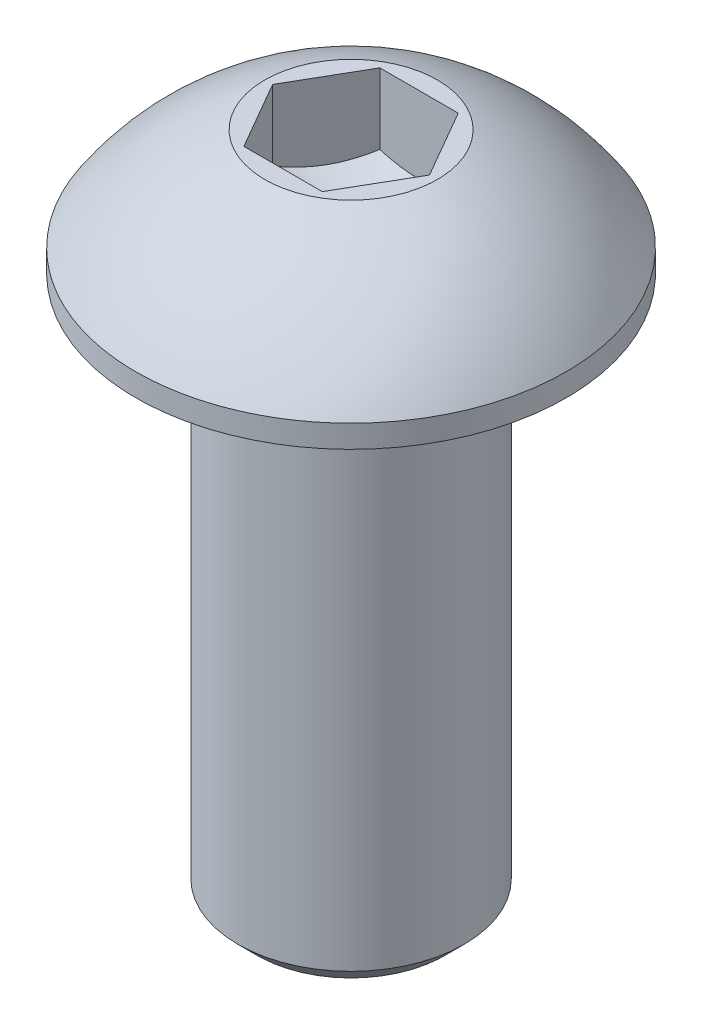
ISO-10303-21;
HEADER;
FILE_DESCRIPTION(('STEP AP214'),'2;1');
FILE_NAME('part.step','',(''),(''),'','','');
FILE_SCHEMA(('AUTOMOTIVE_DESIGN { 1 0 10303 214 1 1 1 1 }'));
ENDSEC;
DATA;
#1=APPLICATION_CONTEXT('core data for automotive mechanical design processes');
#2=APPLICATION_PROTOCOL_DEFINITION('international standard','automotive_design',2000,#1);
#3=PRODUCT_CONTEXT('',#1,'mechanical');
#4=PRODUCT('Part','Part','',(#3));
#5=PRODUCT_RELATED_PRODUCT_CATEGORY('part','',(#4));
#6=PRODUCT_DEFINITION_FORMATION('','',#4);
#7=PRODUCT_DEFINITION_CONTEXT('part definition',#1,'design');
#8=PRODUCT_DEFINITION('design','',#6,#7);
#9=PRODUCT_DEFINITION_SHAPE('','',#8);
#10=(LENGTH_UNIT() NAMED_UNIT(*) SI_UNIT(.MILLI.,.METRE.));
#11=(NAMED_UNIT(*) PLANE_ANGLE_UNIT() SI_UNIT($,.RADIAN.));
#12=(NAMED_UNIT(*) SI_UNIT($,.STERADIAN.) SOLID_ANGLE_UNIT());
#13=UNCERTAINTY_MEASURE_WITH_UNIT(LENGTH_MEASURE(1.E-05),#10,'distance_accuracy_value','');
#14=(GEOMETRIC_REPRESENTATION_CONTEXT(3) GLOBAL_UNCERTAINTY_ASSIGNED_CONTEXT((#13)) GLOBAL_UNIT_ASSIGNED_CONTEXT((#10,
#11,#12)) REPRESENTATION_CONTEXT('',''));
#15=CARTESIAN_POINT('',(0.,0.,0.));
#16=DIRECTION('',(0.,0.,1.));
#17=DIRECTION('',(1.,0.,0.));
#18=AXIS2_PLACEMENT_3D('',#15,#16,#17);
#19=CARTESIAN_POINT('',(-21.8546817558082,61.0625140259608,28.5661719553128));
#20=DIRECTION('',(-0.866156744758905,0.,0.499772441725888));
#21=DIRECTION('',(0.499772441725888,0.,0.866156744758905));
#22=AXIS2_PLACEMENT_3D('',#19,#20,#21);
#23=PLANE('',#22);
#24=CARTESIAN_POINT('',(-22.7342528083247,62.1904554538153,27.0417846839019));
#25=CARTESIAN_POINT('',(-22.6962224262547,62.1684624393729,27.1076956724396));
#26=CARTESIAN_POINT('',(-22.6578636820594,62.1484570513763,27.174175482085));
#27=CARTESIAN_POINT('',(-22.5804812568193,62.1135294060499,27.3082872722689));
#28=CARTESIAN_POINT('',(-22.5414561961779,62.0986195140733,27.3759216432276));
#29=CARTESIAN_POINT('',(-22.4638894317458,62.0753989685705,27.5103527421773));
#30=CARTESIAN_POINT('',(-22.4253596878144,62.0669340457233,27.5771287409575));
#31=CARTESIAN_POINT('',(-22.3481179031428,62.0568098745359,27.7109966612728));
#32=CARTESIAN_POINT('',(-22.3094061449704,62.0551422667687,27.7780880931087));
#33=CARTESIAN_POINT('',(-22.2370748122382,62.0585212235068,27.9034456866582));
#34=CARTESIAN_POINT('',(-22.2034445187518,62.0627268894704,27.9617304248086));
#35=CARTESIAN_POINT('',(-22.1364024681255,62.0760806101147,28.0779211543425));
#36=CARTESIAN_POINT('',(-22.1029909424824,62.0852332430224,28.1358267445177));
#37=CARTESIAN_POINT('',(-22.0358096464586,62.1081249634576,28.252258799859));
#38=CARTESIAN_POINT('',(-22.0020483752909,62.1219613063862,28.3107705350252));
#39=CARTESIAN_POINT('',(-21.9350293192808,62.1533709961757,28.4269214120728));
#40=CARTESIAN_POINT('',(-21.9017706760868,62.1709369529323,28.4845620415652));
#41=CARTESIAN_POINT('',(-21.8687507539284,62.1900007266462,28.5417889429728));
#42=B_SPLINE_CURVE_WITH_KNOTS('',3,(#24,#25,#26,#27,#28,#29,#30,#31,#32,#33,#34,#35,#36,#37,#38,
#39,#40,#41),.UNSPECIFIED.,.F.,.F.,(4,2,2,2,2,2,2,2,4),(0.,0.237724267371401,0.476021395835123,
0.708417766977364,0.94052824763135,1.14260334856072,1.34486578321274,1.5516158742399,
1.75796005763316),.UNSPECIFIED.);
#43=CARTESIAN_POINT('',(-22.7342507548067,62.1904554104379,27.0417867616985));
#44=VERTEX_POINT('',#43);
#45=CARTESIAN_POINT('',(-21.8687514026738,62.1900003520924,28.5417878186306));
#46=VERTEX_POINT('',#45);
#47=EDGE_CURVE('E89',#44,#46,#42,.T.);
#48=ORIENTED_EDGE('',*,*,#47,.T.);
#49=DIRECTION('',(0.,1.,0.));
#50=VECTOR('',#49,1.);
#51=CARTESIAN_POINT('',(-21.8687520125237,61.0625140259608,28.5417867616985));
#52=LINE('',#51,#50);
#53=CARTESIAN_POINT('',(-21.8687520125237,63.7500000000004,28.5417867616985));
#54=VERTEX_POINT('',#53);
#55=EDGE_CURVE('E125',#54,#46,#52,.F.);
#56=ORIENTED_EDGE('',*,*,#55,.F.);
#57=DIRECTION('',(0.499772441725888,0.,0.866156744758905));
#58=VECTOR('',#57,1.);
#59=CARTESIAN_POINT('',(-21.8546817558082,63.7500000000004,28.5661719553128));
#60=LINE('',#59,#58);
#61=CARTESIAN_POINT('',(-22.7342514886348,63.7500000000004,27.0417867616985));
#62=VERTEX_POINT('',#61);
#63=EDGE_CURVE('E135',#54,#62,#60,.F.);
#64=ORIENTED_EDGE('',*,*,#63,.T.);
#65=DIRECTION('',(0.,1.,0.));
#66=VECTOR('',#65,1.);
#67=CARTESIAN_POINT('',(-22.7342520125237,61.0625140259608,27.0417867616985));
#68=LINE('',#67,#66);
#69=EDGE_CURVE('E133',#62,#44,#68,.F.);
#70=ORIENTED_EDGE('',*,*,#69,.T.);
#71=EDGE_LOOP('',(#48,#56,#64,#70));
#72=FACE_BOUND('',#71,.T.);
#73=ADVANCED_FACE('F17',(#72),#23,.T.);
#74=CARTESIAN_POINT('',(-22.7483222692391,61.0625140259608,30.0661719553128));
#75=DIRECTION('',(-0.866156744758905,0.,-0.499772441725888));
#76=DIRECTION('',(-0.499772441725888,0.,0.866156744758905));
#77=AXIS2_PLACEMENT_3D('',#74,#75,#76);
#78=PLANE('',#77);
#79=CARTESIAN_POINT('',(-21.86875020426,62.1900006982455,28.5417842269256));
#80=CARTESIAN_POINT('',(-21.9067681694746,62.1680447159372,28.6076728641433));
#81=CARTESIAN_POINT('',(-21.9451142072188,62.1480787424738,28.6741303110434));
#82=CARTESIAN_POINT('',(-22.0224698008868,62.1132330548813,28.8081953492313));
#83=CARTESIAN_POINT('',(-22.0614807284407,62.0983656634246,28.8758053181742));
#84=CARTESIAN_POINT('',(-22.1390187494334,62.0752296986146,29.0101866672823));
#85=CARTESIAN_POINT('',(-22.1775339263733,62.0668069329424,29.076937396266));
#86=CARTESIAN_POINT('',(-22.2547448417093,62.0567640464411,29.2107517996408));
#87=CARTESIAN_POINT('',(-22.2934403005898,62.0551355919145,29.2778149895856));
#88=CARTESIAN_POINT('',(-22.365770989413,62.0585827085798,29.4031714712144));
#89=CARTESIAN_POINT('',(-22.3994170626068,62.0628231270349,29.4614835558376));
#90=CARTESIAN_POINT('',(-22.4664894034338,62.0762481138211,29.5777267803725));
#91=CARTESIAN_POINT('',(-22.4999154380555,62.0854372676584,29.6356575164521));
#92=CARTESIAN_POINT('',(-22.5671254577182,62.1084023640031,29.7521393530926));
#93=CARTESIAN_POINT('',(-22.6009009168827,62.1222755995713,29.8106756774333));
#94=CARTESIAN_POINT('',(-22.667947538881,62.1537572045911,29.9268743290077));
#95=CARTESIAN_POINT('',(-22.7012195633744,62.171358169387,29.9845381495859));
#96=CARTESIAN_POINT('',(-22.7342527676128,62.1904554840777,30.0417880703452));
#97=B_SPLINE_CURVE_WITH_KNOTS('',3,(#79,#80,#81,#82,#83,#84,#85,#86,#87,#88,#89,#90,#91,#92,#93,
#94,#95,#96),.UNSPECIFIED.,.F.,.F.,(4,2,2,2,2,2,2,2,4),(0.,0.237619597645058,0.475809511941949,
0.708105088056941,0.940115653499667,1.14229164083243,1.34465528790194,1.55151117233297,
1.75795995451333),.UNSPECIFIED.);
#98=CARTESIAN_POINT('',(-22.734252814121,62.190455510966,30.0417881509487));
#99=VERTEX_POINT('',#98);
#100=EDGE_CURVE('E103',#46,#99,#97,.T.);
#101=ORIENTED_EDGE('',*,*,#100,.T.);
#102=DIRECTION('',(0.,1.,0.));
#103=VECTOR('',#102,1.);
#104=CARTESIAN_POINT('',(-22.7342528875693,61.0625140259608,30.041788278242));
#105=LINE('',#104,#103);
#106=CARTESIAN_POINT('',(-22.7342524500465,63.7500000000004,30.0417875199703));
#107=VERTEX_POINT('',#106);
#108=EDGE_CURVE('E122',#99,#107,#105,.T.);
#109=ORIENTED_EDGE('',*,*,#108,.T.);
#110=DIRECTION('',(-0.499772441725888,0.,0.866156744758905));
#111=VECTOR('',#110,1.);
#112=CARTESIAN_POINT('',(-22.7483222692391,63.7500000000004,30.0661719553128));
#113=LINE('',#112,#111);
#114=EDGE_CURVE('E130',#107,#54,#113,.F.);
#115=ORIENTED_EDGE('',*,*,#114,.T.);
#116=ORIENTED_EDGE('',*,*,#55,.T.);
#117=EDGE_LOOP('',(#101,#109,#115,#116));
#118=FACE_BOUND('',#117,.T.);
#119=ADVANCED_FACE('F234',(#118),#78,.T.);
#120=CARTESIAN_POINT('',(-25.3448222692391,61.0625140259608,28.5174015680842));
#121=DIRECTION('',(0.866156744758905,0.,-0.499772441725888));
#122=DIRECTION('',(-0.499772441725888,0.,-0.866156744758905));
#123=AXIS2_PLACEMENT_3D('',#120,#121,#122);
#124=PLANE('',#123);
#125=CARTESIAN_POINT('',(-24.4652514786392,62.1904553031669,30.0417883751702));
#126=CARTESIAN_POINT('',(-24.5032818590422,62.1684622991971,29.9758773961842));
#127=CARTESIAN_POINT('',(-24.5416405999992,62.148456923675,29.9093975948844));
#128=CARTESIAN_POINT('',(-24.6190230169533,62.1135293054301,29.775285821065));
#129=CARTESIAN_POINT('',(-24.6580480725407,62.0986194280445,29.7076514581276));
#130=CARTESIAN_POINT('',(-24.7356148272826,62.0753989112265,29.5732203754476));
#131=CARTESIAN_POINT('',(-24.7741445665863,62.0669340025411,29.5064443848775));
#132=CARTESIAN_POINT('',(-24.851386341352,62.0568098588198,29.3725764818682));
#133=CARTESIAN_POINT('',(-24.8900980942473,62.0551422643686,29.3054850591264));
#134=CARTESIAN_POINT('',(-24.9624293971139,62.0585212429134,29.1801275173046));
#135=CARTESIAN_POINT('',(-24.9960596661154,62.0627269146017,29.1218428216002));
#136=CARTESIAN_POINT('',(-25.0631016678259,62.0760806388834,29.0056521768503));
#137=CARTESIAN_POINT('',(-25.0965131690391,62.0852332696858,28.9477466290119));
#138=CARTESIAN_POINT('',(-25.1636944154409,62.1081249788471,28.8313146596682));
#139=CARTESIAN_POINT('',(-25.1974556614366,62.1219613123591,28.7728029681282));
#140=CARTESIAN_POINT('',(-25.2644746679246,62.1533709778999,28.6566521769087));
#141=CARTESIAN_POINT('',(-25.2977332867657,62.1709369198492,28.599011589623));
#142=CARTESIAN_POINT('',(-25.3307531849423,62.1900006768672,28.5417847297771));
#143=B_SPLINE_CURVE_WITH_KNOTS('',3,(#125,#126,#127,#128,#129,#130,#131,#132,#133,#134,#135,
#136,#137,#138,#139,#140,#141,#142),.UNSPECIFIED.,.F.,.F.,(4,2,2,2,2,2,2,2,4),(0.,
0.237724232173708,0.476021324387903,0.70841766280578,0.940528111140701,1.14260306690965,
1.34486535582354,1.5516152934174,1.7579593244486),.UNSPECIFIED.);
#144=CARTESIAN_POINT('',(-24.4652516116366,62.1904552792749,30.0417874564768));
#145=VERTEX_POINT('',#144);
#146=CARTESIAN_POINT('',(-25.3307533026176,62.1900007448073,28.5417845258338));
#147=VERTEX_POINT('',#146);
#148=EDGE_CURVE('E98',#145,#147,#143,.T.);
#149=ORIENTED_EDGE('',*,*,#148,.T.);
#150=DIRECTION('',(0.,1.,0.));
#151=VECTOR('',#150,1.);
#152=CARTESIAN_POINT('',(-25.3307534410709,61.0625140259608,28.5417842858801));
#153=LINE('',#152,#151);
#154=CARTESIAN_POINT('',(-25.3307527267973,63.7500000000004,28.5417855237893));
#155=VERTEX_POINT('',#154);
#156=EDGE_CURVE('E92',#147,#155,#153,.T.);
#157=ORIENTED_EDGE('',*,*,#156,.T.);
#158=DIRECTION('',(-0.499772441725888,0.,-0.866156744758905));
#159=VECTOR('',#158,1.);
#160=CARTESIAN_POINT('',(-25.3448222692391,63.7500000000004,28.5174015680842));
#161=LINE('',#160,#159);
#162=CARTESIAN_POINT('',(-24.4652520561413,63.7500000000004,30.0417867616985));
#163=VERTEX_POINT('',#162);
#164=EDGE_CURVE('E119',#155,#163,#161,.F.);
#165=ORIENTED_EDGE('',*,*,#164,.T.);
#166=DIRECTION('',(0.,1.,0.));
#167=VECTOR('',#166,1.);
#168=CARTESIAN_POINT('',(-24.4652520125237,61.0625140259608,30.0417867616985));
#169=LINE('',#168,#167);
#170=EDGE_CURVE('E115',#163,#145,#169,.F.);
#171=ORIENTED_EDGE('',*,*,#170,.T.);
#172=EDGE_LOOP('',(#149,#157,#165,#171));
#173=FACE_BOUND('',#172,.T.);
#174=ADVANCED_FACE('F228',(#173),#124,.T.);
#175=CARTESIAN_POINT('',(-23.5997520125237,62.1964573418268,28.5417867616985));
#176=DIRECTION('',(0.,1.,0.));
#177=DIRECTION('',(-1.,0.,0.));
#178=AXIS2_PLACEMENT_3D('',#175,#176,#177);
#179=CONICAL_SURFACE('',#178,1.74218444413155,1.04719755108581);
#180=ORIENTED_EDGE('',*,*,#100,.F.);
#181=ORIENTED_EDGE('',*,*,#47,.F.);
#182=CARTESIAN_POINT('',(-23.5997520125237,62.0566320877781,27.0417867616985));
#183=CARTESIAN_POINT('',(-23.5630148355516,62.0566274119055,27.0417867616985));
#184=CARTESIAN_POINT('',(-23.5262826386131,62.0574117739379,27.0417867616985));
#185=CARTESIAN_POINT('',(-23.4528902735742,62.0605174408231,27.0417867616985));
#186=CARTESIAN_POINT('',(-23.4162300926826,62.0628384421505,27.0417867616985));
#187=CARTESIAN_POINT('',(-23.3068066593674,62.0720135290242,27.0417867616985));
#188=CARTESIAN_POINT('',(-23.2342202637973,62.0810805744324,27.0417867616985));
#189=CARTESIAN_POINT('',(-23.0900035149575,62.1043976980786,27.0417867616985));
#190=CARTESIAN_POINT('',(-23.0183721891419,62.1186420069205,27.0417867616985));
#191=CARTESIAN_POINT('',(-22.8757252559622,62.1514940000289,27.0417867616985));
#192=CARTESIAN_POINT('',(-22.8047146168983,62.1701234572168,27.0417867616985));
#193=CARTESIAN_POINT('',(-22.7342494569347,62.1904557849312,27.0417867616985));
#194=B_SPLINE_CURVE_WITH_KNOTS('',3,(#182,#183,#184,#185,#186,#187,#188,#189,#190,#191,#192,
#193),.UNSPECIFIED.,.F.,.F.,(4,2,2,2,2,4),(0.,0.110193872639444,0.220365985687168,
0.439573010559326,0.658536502537635,0.878611009104459),.UNSPECIFIED.);
#195=CARTESIAN_POINT('',(-23.5997520125237,62.0566320877703,27.0417867616985));
#196=VERTEX_POINT('',#195);
#197=EDGE_CURVE('E21',#196,#44,#194,.T.);
#198=ORIENTED_EDGE('',*,*,#197,.F.);
#199=DIRECTION('',(0.,-0.499999999999999,0.86602540378444));
#200=VECTOR('',#199,1.);
#201=CARTESIAN_POINT('',(-23.5997520124626,288142.496324036,-498942.916426477));
#202=LINE('',#201,#200);
#203=CARTESIAN_POINT('',(-23.5997520125237,61.1906066839367,28.5417867614512));
#204=VERTEX_POINT('',#203);
#205=EDGE_CURVE('E87',#196,#204,#202,.T.);
#206=ORIENTED_EDGE('',*,*,#205,.T.);
#207=DIRECTION('',(0.,-0.499999999999999,-0.86602540378444));
#208=VECTOR('',#207,1.);
#209=CARTESIAN_POINT('',(-23.5997520125237,288142.496324036,499000.));
#210=LINE('',#209,#208);
#211=CARTESIAN_POINT('',(-23.5997520125237,62.0566320877683,30.041786761685));
#212=VERTEX_POINT('',#211);
#213=EDGE_CURVE('E102',#204,#212,#210,.F.);
#214=ORIENTED_EDGE('',*,*,#213,.T.);
#215=CARTESIAN_POINT('',(-22.7342495240769,62.1904557545893,30.0417867784536));
#216=CARTESIAN_POINT('',(-22.804714680115,62.1701234362746,30.041786767693));
#217=CARTESIAN_POINT('',(-22.8757253141594,62.1514939844736,30.041786763299));
#218=CARTESIAN_POINT('',(-23.0183722364004,62.1186419981777,30.0417867601061));
#219=CARTESIAN_POINT('',(-23.0900035563042,62.1043976907895,30.0417867612792));
#220=CARTESIAN_POINT('',(-23.2342202935157,62.0810805702296,30.0417867621183));
#221=CARTESIAN_POINT('',(-23.3068066833713,62.0720135264653,30.0417867617827));
#222=CARTESIAN_POINT('',(-23.4162301078834,62.062838441151,30.0417867616562));
#223=CARTESIAN_POINT('',(-23.4528902857582,62.0605174401922,30.0417867616773));
#224=CARTESIAN_POINT('',(-23.5262826447218,62.0574117737952,30.0417867617197));
#225=CARTESIAN_POINT('',(-23.5630148386015,62.0566274118812,30.0417867617408));
#226=CARTESIAN_POINT('',(-23.5997520125237,62.0566320877781,30.0417867616985));
#227=B_SPLINE_CURVE_WITH_KNOTS('',3,(#215,#216,#217,#218,#219,#220,#221,#222,#223,#224,#225,
#226),.UNSPECIFIED.,.F.,.F.,(4,2,2,2,2,4),(0.,0.220074487947493,0.439037961831188,
0.658244969051029,0.768417073011579,0.878610936485432),.UNSPECIFIED.);
#228=EDGE_CURVE('E97',#99,#212,#227,.T.);
#229=ORIENTED_EDGE('',*,*,#228,.F.);
#230=EDGE_LOOP('',(#180,#181,#198,#206,#214,#229));
#231=FACE_BOUND('',#230,.T.);
#232=ADVANCED_FACE('F85',(#231),#179,.F.);
#233=CARTESIAN_POINT('',(-23.5997520125237,62.1964573417131,28.5417867616985));
#234=DIRECTION('',(0.,1.,0.));
#235=DIRECTION('',(0.,0.,1.));
#236=AXIS2_PLACEMENT_3D('',#233,#234,#235);
#237=CONICAL_SURFACE('',#236,1.74218444397811,1.04719755111499);
#238=CARTESIAN_POINT('',(-25.330753448529,62.1900005906256,28.5417888372929));
#239=CARTESIAN_POINT('',(-25.2927355416487,62.1680445839386,28.4759001819881));
#240=CARTESIAN_POINT('',(-25.2543895290304,62.1480786086294,28.4094427297396));
#241=CARTESIAN_POINT('',(-25.1770339570476,62.1132329382352,28.275377693286));
#242=CARTESIAN_POINT('',(-25.1380230259896,62.0983655658131,28.2077677314652));
#243=CARTESIAN_POINT('',(-25.0604850065462,62.075229634716,28.0733863944261));
#244=CARTESIAN_POINT('',(-25.0219698344532,62.0668068838048,28.0066356704445));
#245=CARTESIAN_POINT('',(-24.9447589272823,62.0567640278267,27.8728212787519));
#246=CARTESIAN_POINT('',(-24.9060634717206,62.0551355890925,27.8057580954829));
#247=CARTESIAN_POINT('',(-24.8337328001686,62.0585827327587,27.6804016443662));
#248=CARTESIAN_POINT('',(-24.8000867407571,62.0628231611418,27.6220895834321));
#249=CARTESIAN_POINT('',(-24.7330144276295,62.0762481628938,27.5058464067577));
#250=CARTESIAN_POINT('',(-24.699588406924,62.0854373217478,27.447915694848));
#251=CARTESIAN_POINT('',(-24.6323784153881,62.1084024234997,27.3314339069965));
#252=CARTESIAN_POINT('',(-24.5986029704295,62.1222756593373,27.2728976072655));
#253=CARTESIAN_POINT('',(-24.5315563763409,62.1537572610169,27.1566990040398));
#254=CARTESIAN_POINT('',(-24.4982843655537,62.1713582222283,27.0990352072053));
#255=CARTESIAN_POINT('',(-24.4652511747785,62.1904555318397,27.0417853098005));
#256=B_SPLINE_CURVE_WITH_KNOTS('',3,(#238,#239,#240,#241,#242,#243,#244,#245,#246,#247,#248,
#249,#250,#251,#252,#253,#254,#255),.UNSPECIFIED.,.F.,.F.,(4,2,2,2,2,2,2,2,4),(0.,
0.237619575800249,0.475809465472198,0.708105017028062,0.940115559015367,1.14229146651883,
1.3446550330063,1.55151083429702,1.75795953444988),.UNSPECIFIED.);
#257=CARTESIAN_POINT('',(-24.4652528135948,62.1904556270957,27.0417860649148));
#258=VERTEX_POINT('',#257);
#259=EDGE_CURVE('E175',#147,#258,#256,.T.);
#260=ORIENTED_EDGE('',*,*,#259,.F.);
#261=ORIENTED_EDGE('',*,*,#148,.F.);
#262=CARTESIAN_POINT('',(-23.5997520125237,62.0566320877624,30.0417867616985));
#263=CARTESIAN_POINT('',(-23.6364891905073,62.0566274118893,30.0417867616985));
#264=CARTESIAN_POINT('',(-23.6732213884567,62.0574117739652,30.0417867616985));
#265=CARTESIAN_POINT('',(-23.7466137555115,62.0605174410205,30.0417867616985));
#266=CARTESIAN_POINT('',(-23.7832739374077,62.0628384424746,30.0417867616985));
#267=CARTESIAN_POINT('',(-23.8926973736984,62.0720135298438,30.0417867616985));
#268=CARTESIAN_POINT('',(-23.9652837712248,62.0810805757363,30.0417867616985));
#269=CARTESIAN_POINT('',(-24.1095005239055,62.1043977005855,30.0417867616985));
#270=CARTESIAN_POINT('',(-24.181131851606,62.1186420101453,30.0417867616985));
#271=CARTESIAN_POINT('',(-24.3237787885203,62.1514940048561,30.0417867616985));
#272=CARTESIAN_POINT('',(-24.3947894294336,62.1701234629302,30.0417867616985));
#273=CARTESIAN_POINT('',(-24.4652545912193,62.1904557915737,30.0417867616985));
#274=B_SPLINE_CURVE_WITH_KNOTS('',3,(#262,#263,#264,#265,#266,#267,#268,#269,#270,#271,#272,
#273),.UNSPECIFIED.,.F.,.F.,(4,2,2,2,2,4),(0.,0.11019387567229,0.220365991749922,
0.439573022608127,0.658536520545098,0.878611033143368),.UNSPECIFIED.);
#275=EDGE_CURVE('E216',#212,#145,#274,.T.);
#276=ORIENTED_EDGE('',*,*,#275,.F.);
#277=ORIENTED_EDGE('',*,*,#213,.F.);
#278=ORIENTED_EDGE('',*,*,#205,.F.);
#279=CARTESIAN_POINT('',(-24.4652544490187,62.1904556369192,27.0417865881283));
#280=CARTESIAN_POINT('',(-24.3947892842702,62.1701233833668,27.0417866996));
#281=CARTESIAN_POINT('',(-24.3237786510699,62.1514939598444,27.0417867451189));
#282=CARTESIAN_POINT('',(-24.181131738041,62.1186419972786,27.0417867781944));
#283=CARTESIAN_POINT('',(-24.1095004264492,62.1043976855637,27.0417867660425));
#284=CARTESIAN_POINT('',(-23.9652837022473,62.0810805638417,27.0417867573496));
#285=CARTESIAN_POINT('',(-23.8926973170677,62.0720135233654,27.041786760826));
#286=CARTESIAN_POINT('',(-23.7832739007154,62.0628384402689,27.041786762137));
#287=CARTESIAN_POINT('',(-23.7466137260066,62.0605174395945,27.0417867619178));
#288=CARTESIAN_POINT('',(-23.6732213736119,62.0574117735156,27.0417867614792));
#289=CARTESIAN_POINT('',(-23.6364891831354,62.056627411626,27.0417867612598));
#290=CARTESIAN_POINT('',(-23.5997520125237,62.0566320877624,27.0417867616985));
#291=B_SPLINE_CURVE_WITH_KNOTS('',3,(#279,#280,#281,#282,#283,#284,#285,#286,#287,#288,#289,
#290),.UNSPECIFIED.,.F.,.F.,(4,2,2,2,2,4),(0.,0.220074464165182,0.439037917358345,
0.658244908711105,0.768417003217285,0.878610856576213),.UNSPECIFIED.);
#292=EDGE_CURVE('E93',#258,#196,#291,.T.);
#293=ORIENTED_EDGE('',*,*,#292,.F.);
#294=EDGE_LOOP('',(#260,#261,#276,#277,#278,#293));
#295=FACE_BOUND('',#294,.T.);
#296=ADVANCED_FACE('F100',(#295),#237,.F.);
#297=CARTESIAN_POINT('',(-24.4934053389993,61.0625140259608,30.0417867616985));
#298=DIRECTION('',(0.,0.,-1.));
#299=DIRECTION('',(-1.,0.,0.));
#300=AXIS2_PLACEMENT_3D('',#297,#298,#299);
#301=PLANE('',#300);
#302=ORIENTED_EDGE('',*,*,#275,.T.);
#303=ORIENTED_EDGE('',*,*,#170,.F.);
#304=DIRECTION('',(1.,0.,0.));
#305=VECTOR('',#304,1.);
#306=CARTESIAN_POINT('',(-25.5419340125236,63.7500000000004,30.0417867616985));
#307=LINE('',#306,#305);
#308=EDGE_CURVE('E142',#107,#163,#307,.F.);
#309=ORIENTED_EDGE('',*,*,#308,.F.);
#310=ORIENTED_EDGE('',*,*,#108,.F.);
#311=ORIENTED_EDGE('',*,*,#228,.T.);
#312=EDGE_LOOP('',(#302,#303,#309,#310,#311));
#313=FACE_BOUND('',#312,.T.);
#314=ADVANCED_FACE('F210',(#313),#301,.T.);
#315=CARTESIAN_POINT('',(-24.4511817558082,61.0625140259608,27.0174015680842));
#316=DIRECTION('',(0.866156744758905,0.,0.499772441725888));
#317=DIRECTION('',(0.499772441725888,0.,-0.866156744758905));
#318=AXIS2_PLACEMENT_3D('',#315,#316,#317);
#319=PLANE('',#318);
#320=ORIENTED_EDGE('',*,*,#259,.T.);
#321=DIRECTION('',(0.,1.,0.));
#322=VECTOR('',#321,1.);
#323=CARTESIAN_POINT('',(-24.4652520125237,61.0625140259608,27.0417867616985));
#324=LINE('',#323,#322);
#325=CARTESIAN_POINT('',(-24.4652520125237,63.7500000000004,27.0417867616985));
#326=VERTEX_POINT('',#325);
#327=EDGE_CURVE('E41',#326,#258,#324,.F.);
#328=ORIENTED_EDGE('',*,*,#327,.F.);
#329=DIRECTION('',(0.499772441725888,0.,-0.866156744758906));
#330=VECTOR('',#329,1.);
#331=CARTESIAN_POINT('',(-25.3307520125237,63.7500000000004,28.5417867616985));
#332=LINE('',#331,#330);
#333=EDGE_CURVE('E145',#155,#326,#332,.T.);
#334=ORIENTED_EDGE('',*,*,#333,.F.);
#335=ORIENTED_EDGE('',*,*,#156,.F.);
#336=EDGE_LOOP('',(#320,#328,#334,#335));
#337=FACE_BOUND('',#336,.T.);
#338=ADVANCED_FACE('F192',(#337),#319,.T.);
#339=CARTESIAN_POINT('',(-22.706098686048,61.0625140259608,27.0417867616985));
#340=DIRECTION('',(0.,0.,1.));
#341=DIRECTION('',(1.,0.,0.));
#342=AXIS2_PLACEMENT_3D('',#339,#340,#341);
#343=PLANE('',#342);
#344=ORIENTED_EDGE('',*,*,#197,.T.);
#345=ORIENTED_EDGE('',*,*,#69,.F.);
#346=DIRECTION('',(1.,0.,0.));
#347=VECTOR('',#346,1.);
#348=CARTESIAN_POINT('',(-25.5419340125236,63.7500000000004,27.0417867616985));
#349=LINE('',#348,#347);
#350=EDGE_CURVE('E174',#326,#62,#349,.T.);
#351=ORIENTED_EDGE('',*,*,#350,.F.);
#352=ORIENTED_EDGE('',*,*,#327,.T.);
#353=ORIENTED_EDGE('',*,*,#292,.T.);
#354=EDGE_LOOP('',(#344,#345,#351,#352,#353));
#355=FACE_BOUND('',#354,.T.);
#356=ADVANCED_FACE('F94',(#355),#343,.T.);
#357=CARTESIAN_POINT('',(-25.5419340125236,63.7500000000004,30.4839687616985));
#358=DIRECTION('',(0.,1.,0.));
#359=DIRECTION('',(0.,0.,1.));
#360=AXIS2_PLACEMENT_3D('',#357,#358,#359);
#361=PLANE('',#360);
#362=CARTESIAN_POINT('',(-23.5997520125237,63.7500000000004,26.6376867616985));
#363=CARTESIAN_POINT('',(-23.5462908556264,63.7500000000004,26.6376870822875));
#364=CARTESIAN_POINT('',(-23.4928198734091,63.7500000000004,26.6399403082542));
#365=CARTESIAN_POINT('',(-23.3862474286709,63.7500000000004,26.6489385571315));
#366=CARTESIAN_POINT('',(-23.333146079922,63.7500000000004,26.6556849061613));
#367=CARTESIAN_POINT('',(-23.2276110754911,63.7500000000004,26.6736390679341));
#368=CARTESIAN_POINT('',(-23.1751786167028,63.7500000000005,26.6848539627418));
#369=CARTESIAN_POINT('',(-23.0714157292092,63.7500000000003,26.7116678398788));
#370=CARTESIAN_POINT('',(-23.0200862313458,63.7499999999999,26.7272703799234));
#371=CARTESIAN_POINT('',(-22.8685215512124,63.7499999999996,26.7804441461893));
#372=CARTESIAN_POINT('',(-22.7704551130834,63.7500000000004,26.8244251928022));
#373=CARTESIAN_POINT('',(-22.583110239468,63.7500000000004,26.9282479031549));
#374=CARTESIAN_POINT('',(-22.4938321382278,63.7499999999997,26.988090169824));
#375=CARTESIAN_POINT('',(-22.3684408274207,63.75,27.08839529384));
#376=CARTESIAN_POINT('',(-22.3280410747537,63.7500000000003,27.1236137742219));
#377=CARTESIAN_POINT('',(-22.2503870331904,63.7500000000005,27.1972892516482));
#378=CARTESIAN_POINT('',(-22.2131297491483,63.7500000000004,27.2357430935362));
#379=CARTESIAN_POINT('',(-22.1063975560784,63.7500000000003,27.3556502463894));
#380=CARTESIAN_POINT('',(-22.0419351834624,63.7500000000004,27.4416709244357));
#381=CARTESIAN_POINT('',(-21.928405286053,63.7500000000004,27.6232669284007));
#382=CARTESIAN_POINT('',(-21.879337180765,63.7500000000004,27.7188418938626));
#383=CARTESIAN_POINT('',(-21.7979340758051,63.7500000000004,27.9168837214962));
#384=CARTESIAN_POINT('',(-21.7655988974176,63.7500000000004,28.0193505100468));
#385=CARTESIAN_POINT('',(-21.71859271446,63.7500000000004,28.2282559610265));
#386=CARTESIAN_POINT('',(-21.7039218042245,63.7500000000004,28.334694644664));
#387=CARTESIAN_POINT('',(-21.6926563336143,63.7500000000004,28.5485243519607));
#388=CARTESIAN_POINT('',(-21.6960617732395,63.7500000000004,28.65591537562));
#389=CARTESIAN_POINT('',(-21.7208565836103,63.7500000000004,28.8686036123985));
#390=CARTESIAN_POINT('',(-21.7422458583149,63.7500000000004,28.9739008366963));
#391=CARTESIAN_POINT('',(-21.8023886890805,63.7500000000004,29.1793999143027));
#392=CARTESIAN_POINT('',(-21.8411424306036,63.7500000000004,29.2796017131766));
#393=CARTESIAN_POINT('',(-21.9349622801049,63.7500000000004,29.4721217955092));
#394=CARTESIAN_POINT('',(-21.9900290032398,63.7500000000004,29.564439781503));
#395=CARTESIAN_POINT('',(-22.0835708570972,63.7500000000004,29.6948982343521));
#396=CARTESIAN_POINT('',(-22.1165812752758,63.7500000000004,29.7370540816548));
#397=CARTESIAN_POINT('',(-22.1860638357111,63.7500000000004,29.818481349449));
#398=CARTESIAN_POINT('',(-22.2225392880671,63.7500000000004,29.8577499469715));
#399=CARTESIAN_POINT('',(-22.3366966862082,63.7500000000004,29.970675529456));
#400=CARTESIAN_POINT('',(-22.4191925084001,63.7500000000004,30.0395675867781));
#401=CARTESIAN_POINT('',(-22.5945908828667,63.7500000000004,30.1625011749033));
#402=CARTESIAN_POINT('',(-22.6874930393916,63.7500000000004,30.2165432701765));
#403=CARTESIAN_POINT('',(-22.8326313335269,63.7500000000004,30.2853486279507));
#404=CARTESIAN_POINT('',(-22.8820372084926,63.7500000000004,30.3062583416176));
#405=CARTESIAN_POINT('',(-22.9824081534266,63.7500000000004,30.3438268688872));
#406=CARTESIAN_POINT('',(-23.0333719238721,63.7500000000004,30.3604891227));
#407=CARTESIAN_POINT('',(-23.1364361274676,63.7500000000004,30.3894331898371));
#408=CARTESIAN_POINT('',(-23.1885346261879,63.7500000000004,30.4017219202547));
#409=CARTESIAN_POINT('',(-23.2935715870608,63.7500000000004,30.4218686646798));
#410=CARTESIAN_POINT('',(-23.3465097967267,63.7500000000004,30.4297279855104));
#411=CARTESIAN_POINT('',(-23.4329003820953,63.7500000000004,30.4388567026777));
#412=CARTESIAN_POINT('',(-23.4662144405515,63.7500000000004,30.4414921404598));
#413=CARTESIAN_POINT('',(-23.5329350577243,63.7500000000004,30.4450072701458));
#414=CARTESIAN_POINT('',(-23.5663416164409,63.7500000000004,30.4458869620496));
#415=CARTESIAN_POINT('',(-23.653213169421,63.7500000000004,30.4458864411095));
#416=CARTESIAN_POINT('',(-23.7066841516383,63.7500000000004,30.4436332151428));
#417=CARTESIAN_POINT('',(-23.8132565963765,63.7500000000004,30.4346349662655));
#418=CARTESIAN_POINT('',(-23.8663579451254,63.7500000000004,30.4278886172357));
#419=CARTESIAN_POINT('',(-23.9718929495563,63.7500000000004,30.4099344554629));
#420=CARTESIAN_POINT('',(-24.0243254083446,63.7500000000005,30.3987195606552));
#421=CARTESIAN_POINT('',(-24.1280882958382,63.7500000000003,30.3719056835181));
#422=CARTESIAN_POINT('',(-24.1794177937016,63.7499999999999,30.3563031434736));
#423=CARTESIAN_POINT('',(-24.330982473835,63.7499999999996,30.3031293772077));
#424=CARTESIAN_POINT('',(-24.429048911964,63.7500000000004,30.2591483305949));
#425=CARTESIAN_POINT('',(-24.6163937855794,63.7500000000004,30.1553256202422));
#426=CARTESIAN_POINT('',(-24.7056718868196,63.7499999999997,30.095483353573));
#427=CARTESIAN_POINT('',(-24.8310631976267,63.75,29.995178229557));
#428=CARTESIAN_POINT('',(-24.8714629502937,63.7500000000003,29.9599597491751));
#429=CARTESIAN_POINT('',(-24.949116991857,63.7500000000005,29.8862842717488));
#430=CARTESIAN_POINT('',(-24.9863742758991,63.7500000000004,29.8478304298608));
#431=CARTESIAN_POINT('',(-25.093106468969,63.7500000000003,29.7279232770075));
#432=CARTESIAN_POINT('',(-25.157568841585,63.7500000000004,29.6419025989613));
#433=CARTESIAN_POINT('',(-25.2710987389944,63.7500000000004,29.4603065949962));
#434=CARTESIAN_POINT('',(-25.3201668442824,63.7500000000004,29.3647316295344));
#435=CARTESIAN_POINT('',(-25.4015699492423,63.7500000000004,29.1666898019007));
#436=CARTESIAN_POINT('',(-25.4339051276297,63.7500000000004,29.0642230133501));
#437=CARTESIAN_POINT('',(-25.4809113105874,63.7500000000004,28.8553175623705));
#438=CARTESIAN_POINT('',(-25.4955822208229,63.7500000000004,28.748878878733));
#439=CARTESIAN_POINT('',(-25.5068476914331,63.7500000000004,28.5350491714363));
#440=CARTESIAN_POINT('',(-25.5034422518079,63.7500000000004,28.427658147777));
#441=CARTESIAN_POINT('',(-25.4786474414371,63.7500000000004,28.2149699109985));
#442=CARTESIAN_POINT('',(-25.4572581667325,63.7500000000004,28.1096726867007));
#443=CARTESIAN_POINT('',(-25.3971153359669,63.7500000000004,27.9041736090943));
#444=CARTESIAN_POINT('',(-25.3583615944438,63.7500000000004,27.8039718102204));
#445=CARTESIAN_POINT('',(-25.2645417449425,63.7500000000004,27.6114517278878));
#446=CARTESIAN_POINT('',(-25.2094750218076,63.7500000000004,27.5191337418939));
#447=CARTESIAN_POINT('',(-25.1159331679502,63.7500000000004,27.3886752890449));
#448=CARTESIAN_POINT('',(-25.0829227497716,63.7500000000004,27.3465194417422));
#449=CARTESIAN_POINT('',(-25.0134401893363,63.7500000000004,27.265092173948));
#450=CARTESIAN_POINT('',(-24.9769647369803,63.7500000000004,27.2258235764255));
#451=CARTESIAN_POINT('',(-24.8628073388392,63.7500000000004,27.112897993941));
#452=CARTESIAN_POINT('',(-24.7803115166473,63.7500000000004,27.044005936619));
#453=CARTESIAN_POINT('',(-24.6049131421807,63.7500000000004,26.9210723484937));
#454=CARTESIAN_POINT('',(-24.5120109856559,63.7500000000004,26.8670302532204));
#455=CARTESIAN_POINT('',(-24.3668726915206,63.7500000000004,26.7982248954463));
#456=CARTESIAN_POINT('',(-24.3174668165548,63.7500000000004,26.7773151817794));
#457=CARTESIAN_POINT('',(-24.2170958716208,63.7500000000004,26.7397466545098));
#458=CARTESIAN_POINT('',(-24.1661321011753,63.7500000000004,26.723084400697));
#459=CARTESIAN_POINT('',(-24.0630678975798,63.7500000000004,26.6941403335599));
#460=CARTESIAN_POINT('',(-24.0109693988596,63.7500000000004,26.6818516031422));
#461=CARTESIAN_POINT('',(-23.9059324379867,63.7500000000004,26.6617048587172));
#462=CARTESIAN_POINT('',(-23.8529942283207,63.7500000000004,26.6538455378867));
#463=CARTESIAN_POINT('',(-23.7666036429521,63.7500000000004,26.6447168207193));
#464=CARTESIAN_POINT('',(-23.7332895844959,63.7500000000004,26.6420813829371));
#465=CARTESIAN_POINT('',(-23.6665689673231,63.7500000000004,26.6385662532512));
#466=CARTESIAN_POINT('',(-23.6331624086065,63.7500000000004,26.6376865613474));
#467=CARTESIAN_POINT('',(-23.5997520125237,63.7500000000004,26.6376867616985));
#468=B_SPLINE_CURVE_WITH_KNOTS('',3,(#362,#363,#364,#365,#366,#367,#368,#369,#370,#371,#372,
#373,#374,#375,#376,#377,#378,#379,#380,#381,#382,#383,#384,#385,#386,#387,#388,#389,#390,#391,
#392,#393,#394,#395,#396,#397,#398,#399,#400,#401,#402,#403,#404,#405,#406,#407,#408,#409,#410,
#411,#412,#413,#414,#415,#416,#417,#418,#419,#420,#421,#422,#423,#424,#425,#426,#427,#428,#429,
#430,#431,#432,#433,#434,#435,#436,#437,#438,#439,#440,#441,#442,#443,#444,#445,#446,#447,#448,
#449,#450,#451,#452,#453,#454,#455,#456,#457,#458,#459,#460,#461,#462,#463,#464,#465,#466,#467),
.UNSPECIFIED.,.T.,.F.,(4,2,2,2,2,2,2,2,2,2,2,2,2,2,2,2,2,2,2,2,2,2,2,2,2,2,2,2,2,2,2,2,2,2,2,2,
2,2,2,2,2,2,2,2,2,2,2,2,2,2,2,2,4),(0.,0.160352712781919,0.320752773721164,0.481408065586315,
0.642194002028574,0.962999427349943,1.283817049133,1.44443605549274,1.60490020093867,
1.92572553703687,2.24653877384262,2.56734858414248,2.88816010769531,3.20897163124817,
3.52978144154807,3.85059467835378,4.17142001445155,4.33188415989731,4.4925031662569,
4.81332078804016,5.13412621336176,5.29491214980424,5.45556744166957,5.6159675026089,
5.77632021539092,5.8765321815721,5.97674414775328,6.1370968605352,6.29749692147445,
6.4581522133396,6.61893814978186,6.93974357510322,7.26056119688629,7.42118020324602,
7.58164434869195,7.90246968479014,8.2232829215959,8.54409273189576,8.86490425544858,
9.18571577900144,9.50652558930135,9.82733882610707,10.1481641622048,10.3086283076506,
10.4692473140102,10.7900649357934,11.110870361115,11.2716562975575,11.4323115894228,
11.5927116503622,11.7530643631442,11.8532763293254,11.9534882955066),.UNSPECIFIED.);
#469=CARTESIAN_POINT('',(-23.5997520125237,63.7500000000004,26.6376867616985));
#470=VERTEX_POINT('',#469);
#471=EDGE_CURVE('E167',#470,#470,#468,.T.);
#472=ORIENTED_EDGE('',*,*,#471,.F.);
#473=EDGE_LOOP('',(#472));
#474=FACE_BOUND('',#473,.T.);
#475=ORIENTED_EDGE('',*,*,#333,.T.);
#476=ORIENTED_EDGE('',*,*,#350,.T.);
#477=ORIENTED_EDGE('',*,*,#63,.F.);
#478=ORIENTED_EDGE('',*,*,#114,.F.);
#479=ORIENTED_EDGE('',*,*,#308,.T.);
#480=ORIENTED_EDGE('',*,*,#164,.F.);
#481=EDGE_LOOP('',(#475,#476,#477,#478,#479,#480));
#482=FACE_BOUND('',#481,.T.);
#483=ADVANCED_FACE('F186',(#474,#482),#361,.T.);
#484=CARTESIAN_POINT('',(-23.5997520125237,58.4167992911115,28.5417867616985));
#485=DIRECTION('',(0.,0.,-1.));
#486=DIRECTION('',(1.,0.,0.));
#487=AXIS2_PLACEMENT_3D('',#484,#485,#486);
#488=SPHERICAL_SURFACE('',#487,5.66291679360495);
#489=ORIENTED_EDGE('',*,*,#471,.T.);
#490=EDGE_LOOP('',(#489));
#491=FACE_BOUND('',#490,.T.);
#492=CARTESIAN_POINT('',(-23.5997520125237,61.5000000000004,28.5417867616985));
#493=DIRECTION('',(0.,-1.,0.));
#494=DIRECTION('',(0.,0.,-1.));
#495=AXIS2_PLACEMENT_3D('',#492,#493,#494);
#496=CIRCLE('',#495,4.75);
#497=CARTESIAN_POINT('',(-23.5997520125237,61.5000000000004,23.7917867616985));
#498=VERTEX_POINT('',#497);
#499=EDGE_CURVE('E164',#498,#498,#496,.T.);
#500=ORIENTED_EDGE('',*,*,#499,.F.);
#501=EDGE_LOOP('',(#500));
#502=FACE_BOUND('',#501,.T.);
#503=ADVANCED_FACE('F182',(#491,#502),#488,.T.);
#504=CARTESIAN_POINT('',(-23.5997520125237,61.5000000000004,28.5417867616985));
#505=DIRECTION('',(0.,-1.,0.));
#506=DIRECTION('',(0.,0.,-1.));
#507=AXIS2_PLACEMENT_3D('',#504,#505,#506);
#508=CYLINDRICAL_SURFACE('',#507,4.75);
#509=ORIENTED_EDGE('',*,*,#499,.T.);
#510=EDGE_LOOP('',(#509));
#511=FACE_BOUND('',#510,.T.);
#512=CARTESIAN_POINT('',(-23.5997520125237,61.0000000000004,28.5417867616985));
#513=DIRECTION('',(0.,-1.,0.));
#514=DIRECTION('',(0.,0.,-1.));
#515=AXIS2_PLACEMENT_3D('',#512,#513,#514);
#516=CIRCLE('',#515,4.75);
#517=CARTESIAN_POINT('',(-23.5997520125237,61.0000000000004,23.7917867616985));
#518=VERTEX_POINT('',#517);
#519=EDGE_CURVE('E161',#518,#518,#516,.T.);
#520=ORIENTED_EDGE('',*,*,#519,.F.);
#521=EDGE_LOOP('',(#520));
#522=FACE_BOUND('',#521,.T.);
#523=ADVANCED_FACE('F268',(#511,#522),#508,.T.);
#524=CARTESIAN_POINT('',(-21.0997520125237,49.0000000000004,31.0417867616985));
#525=DIRECTION('',(0.,-1.,0.));
#526=DIRECTION('',(0.,0.,-1.));
#527=AXIS2_PLACEMENT_3D('',#524,#525,#526);
#528=PLANE('',#527);
#529=CARTESIAN_POINT('',(-23.5997520125237,49.000000000035,28.5417867616985));
#530=DIRECTION('',(0.,1.,0.));
#531=DIRECTION('',(-1.,0.,0.));
#532=AXIS2_PLACEMENT_3D('',#529,#530,#531);
#533=CIRCLE('',#532,2.06704000003411);
#534=CARTESIAN_POINT('',(-25.6667920125578,49.000000000035,28.5417867616985));
#535=VERTEX_POINT('',#534);
#536=EDGE_CURVE('E158',#535,#535,#533,.T.);
#537=ORIENTED_EDGE('',*,*,#536,.F.);
#538=EDGE_LOOP('',(#537));
#539=FACE_BOUND('',#538,.T.);
#540=ADVANCED_FACE('F265',(#539),#528,.T.);
#541=CARTESIAN_POINT('',(-18.7547520125237,61.0000000000004,33.3867867616985));
#542=DIRECTION('',(0.,-1.,0.));
#543=DIRECTION('',(0.,0.,-1.));
#544=AXIS2_PLACEMENT_3D('',#541,#542,#543);
#545=PLANE('',#544);
#546=ORIENTED_EDGE('',*,*,#519,.T.);
#547=EDGE_LOOP('',(#546));
#548=FACE_BOUND('',#547,.T.);
#549=CARTESIAN_POINT('',(-23.5997520125237,61.0000000000004,28.5417867616985));
#550=DIRECTION('',(0.,-1.,0.));
#551=DIRECTION('',(0.,0.,-1.));
#552=AXIS2_PLACEMENT_3D('',#549,#550,#551);
#553=CIRCLE('',#552,2.5);
#554=CARTESIAN_POINT('',(-23.5997520125237,61.0000000000004,26.0417867616985));
#555=VERTEX_POINT('',#554);
#556=EDGE_CURVE('E32',#555,#555,#553,.T.);
#557=ORIENTED_EDGE('',*,*,#556,.F.);
#558=EDGE_LOOP('',(#557));
#559=FACE_BOUND('',#558,.T.);
#560=ADVANCED_FACE('F258',(#548,#559),#545,.T.);
#561=CARTESIAN_POINT('',(-23.5997520125237,49.4329599998764,28.5417867616985));
#562=DIRECTION('',(0.,1.,0.));
#563=DIRECTION('',(-1.,0.,0.));
#564=AXIS2_PLACEMENT_3D('',#561,#562,#563);
#565=CONICAL_SURFACE('',#564,2.49999999987549,0.785398163397448);
#566=CARTESIAN_POINT('',(-23.5997520125237,49.4329600000003,28.5417867616985));
#567=DIRECTION('',(0.,1.,0.));
#568=DIRECTION('',(0.,0.,1.));
#569=AXIS2_PLACEMENT_3D('',#566,#567,#568);
#570=CIRCLE('',#569,2.5);
#571=CARTESIAN_POINT('',(-23.5997520125237,49.4329600000003,31.0417867616985));
#572=VERTEX_POINT('',#571);
#573=EDGE_CURVE('E11',#572,#572,#570,.T.);
#574=ORIENTED_EDGE('',*,*,#573,.F.);
#575=EDGE_LOOP('',(#574));
#576=FACE_BOUND('',#575,.T.);
#577=ORIENTED_EDGE('',*,*,#536,.T.);
#578=EDGE_LOOP('',(#577));
#579=FACE_BOUND('',#578,.T.);
#580=ADVANCED_FACE('F252',(#576,#579),#565,.T.);
#581=CARTESIAN_POINT('',(-23.5997520125237,60.2000000000004,28.5417867616985));
#582=DIRECTION('',(0.,1.,0.));
#583=DIRECTION('',(0.,0.,1.));
#584=AXIS2_PLACEMENT_3D('',#581,#582,#583);
#585=CYLINDRICAL_SURFACE('',#584,2.5);
#586=ORIENTED_EDGE('',*,*,#556,.T.);
#587=EDGE_LOOP('',(#586));
#588=FACE_BOUND('',#587,.T.);
#589=ORIENTED_EDGE('',*,*,#573,.T.);
#590=EDGE_LOOP('',(#589));
#591=FACE_BOUND('',#590,.T.);
#592=ADVANCED_FACE('F250',(#588,#591),#585,.T.);
#593=CLOSED_SHELL('',(#73,#119,#174,#232,#296,#314,#338,#356,#483,#503,#523,#540,#560,#580,#592));
#594=MANIFOLD_SOLID_BREP('B1',#593);
#595=ADVANCED_BREP_SHAPE_REPRESENTATION('',(#18,#594),#14);
#596=SHAPE_DEFINITION_REPRESENTATION(#9,#595);
ENDSEC;
END-ISO-10303-21;
